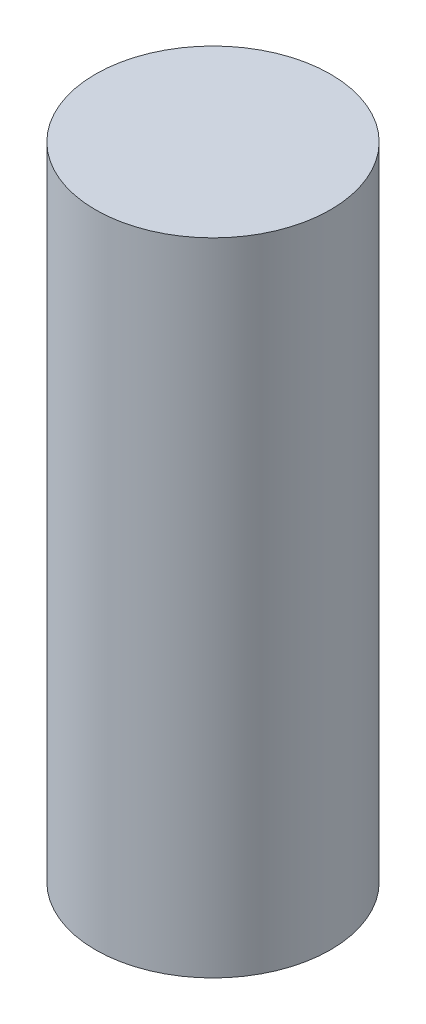
ISO-10303-21;
HEADER;
FILE_DESCRIPTION(('STEP AP214'),'2;1');
FILE_NAME('part.step','',(''),(''),'','','');
FILE_SCHEMA(('AUTOMOTIVE_DESIGN { 1 0 10303 214 1 1 1 1 }'));
ENDSEC;
DATA;
#1=APPLICATION_CONTEXT('core data for automotive mechanical design processes');
#2=APPLICATION_PROTOCOL_DEFINITION('international standard','automotive_design',2000,#1);
#3=PRODUCT_CONTEXT('',#1,'mechanical');
#4=PRODUCT('Part','Part','',(#3));
#5=PRODUCT_RELATED_PRODUCT_CATEGORY('part','',(#4));
#6=PRODUCT_DEFINITION_FORMATION('','',#4);
#7=PRODUCT_DEFINITION_CONTEXT('part definition',#1,'design');
#8=PRODUCT_DEFINITION('design','',#6,#7);
#9=PRODUCT_DEFINITION_SHAPE('','',#8);
#10=(LENGTH_UNIT() NAMED_UNIT(*) SI_UNIT(.MILLI.,.METRE.));
#11=(NAMED_UNIT(*) PLANE_ANGLE_UNIT() SI_UNIT($,.RADIAN.));
#12=(NAMED_UNIT(*) SI_UNIT($,.STERADIAN.) SOLID_ANGLE_UNIT());
#13=UNCERTAINTY_MEASURE_WITH_UNIT(LENGTH_MEASURE(1.E-05),#10,'distance_accuracy_value','');
#14=(GEOMETRIC_REPRESENTATION_CONTEXT(3) GLOBAL_UNCERTAINTY_ASSIGNED_CONTEXT((#13)) GLOBAL_UNIT_ASSIGNED_CONTEXT((#10,
#11,#12)) REPRESENTATION_CONTEXT('',''));
#15=CARTESIAN_POINT('',(0.,0.,0.));
#16=DIRECTION('',(0.,0.,1.));
#17=DIRECTION('',(1.,0.,0.));
#18=AXIS2_PLACEMENT_3D('',#15,#16,#17);
#19=CARTESIAN_POINT('',(0.,15.,0.));
#20=DIRECTION('',(0.,-1.,0.));
#21=DIRECTION('',(0.,0.,-1.));
#22=AXIS2_PLACEMENT_3D('',#19,#20,#21);
#23=CYLINDRICAL_SURFACE('',#22,2.75);
#24=CARTESIAN_POINT('',(0.,15.,0.));
#25=DIRECTION('',(0.,1.,0.));
#26=DIRECTION('',(0.,0.,1.));
#27=AXIS2_PLACEMENT_3D('',#24,#25,#26);
#28=CIRCLE('',#27,2.75);
#29=CARTESIAN_POINT('',(0.,15.,2.75));
#30=VERTEX_POINT('',#29);
#31=EDGE_CURVE('E10',#30,#30,#28,.T.);
#32=ORIENTED_EDGE('',*,*,#31,.F.);
#33=EDGE_LOOP('',(#32));
#34=FACE_BOUND('',#33,.T.);
#35=CARTESIAN_POINT('',(0.,0.,0.));
#36=DIRECTION('',(0.,1.,0.));
#37=DIRECTION('',(0.,0.,1.));
#38=AXIS2_PLACEMENT_3D('',#35,#36,#37);
#39=CIRCLE('',#38,2.75);
#40=CARTESIAN_POINT('',(0.,0.,2.75));
#41=VERTEX_POINT('',#40);
#42=EDGE_CURVE('E40',#41,#41,#39,.T.);
#43=ORIENTED_EDGE('',*,*,#42,.T.);
#44=EDGE_LOOP('',(#43));
#45=FACE_BOUND('',#44,.T.);
#46=ADVANCED_FACE('F37',(#34,#45),#23,.T.);
#47=CARTESIAN_POINT('',(0.,15.,0.));
#48=DIRECTION('',(0.,1.,0.));
#49=DIRECTION('',(0.,0.,1.));
#50=AXIS2_PLACEMENT_3D('',#47,#48,#49);
#51=PLANE('',#50);
#52=ORIENTED_EDGE('',*,*,#31,.T.);
#53=EDGE_LOOP('',(#52));
#54=FACE_BOUND('',#53,.T.);
#55=ADVANCED_FACE('F54',(#54),#51,.T.);
#56=CARTESIAN_POINT('',(0.,0.,0.));
#57=DIRECTION('',(0.,1.,0.));
#58=DIRECTION('',(0.,0.,1.));
#59=AXIS2_PLACEMENT_3D('',#56,#57,#58);
#60=PLANE('',#59);
#61=ORIENTED_EDGE('',*,*,#42,.F.);
#62=EDGE_LOOP('',(#61));
#63=FACE_BOUND('',#62,.T.);
#64=ADVANCED_FACE('F52',(#63),#60,.F.);
#65=CLOSED_SHELL('',(#46,#55,#64));
#66=MANIFOLD_SOLID_BREP('B2',#65);
#67=ADVANCED_BREP_SHAPE_REPRESENTATION('',(#18,#66),#14);
#68=SHAPE_DEFINITION_REPRESENTATION(#9,#67);
ENDSEC;
END-ISO-10303-21;
